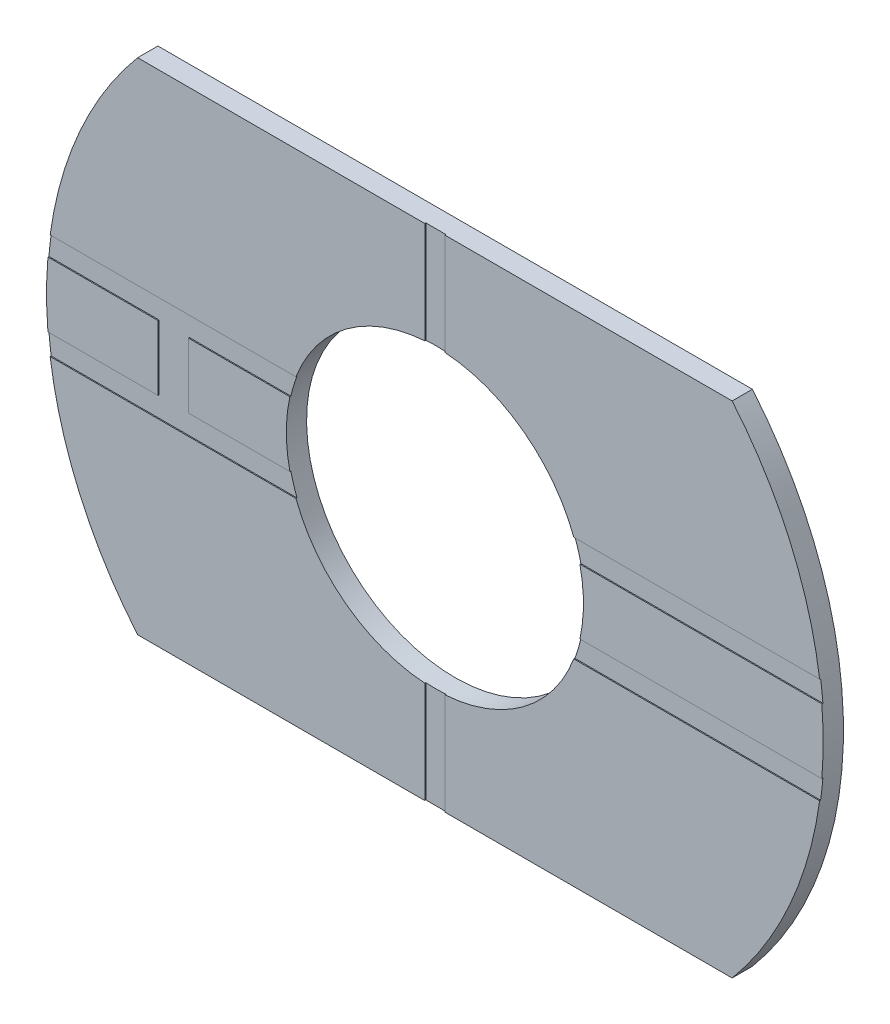
ISO-10303-21;
HEADER;
FILE_DESCRIPTION(('STEP AP214'),'2;1');
FILE_NAME('part.step','',(''),(''),'','','');
FILE_SCHEMA(('AUTOMOTIVE_DESIGN { 1 0 10303 214 1 1 1 1 }'));
ENDSEC;
DATA;
#1=APPLICATION_CONTEXT('core data for automotive mechanical design processes');
#2=APPLICATION_PROTOCOL_DEFINITION('international standard','automotive_design',2000,#1);
#3=PRODUCT_CONTEXT('',#1,'mechanical');
#4=PRODUCT('Part','Part','',(#3));
#5=PRODUCT_RELATED_PRODUCT_CATEGORY('part','',(#4));
#6=PRODUCT_DEFINITION_FORMATION('','',#4);
#7=PRODUCT_DEFINITION_CONTEXT('part definition',#1,'design');
#8=PRODUCT_DEFINITION('design','',#6,#7);
#9=PRODUCT_DEFINITION_SHAPE('','',#8);
#10=(LENGTH_UNIT() NAMED_UNIT(*) SI_UNIT(.MILLI.,.METRE.));
#11=(NAMED_UNIT(*) PLANE_ANGLE_UNIT() SI_UNIT($,.RADIAN.));
#12=(NAMED_UNIT(*) SI_UNIT($,.STERADIAN.) SOLID_ANGLE_UNIT());
#13=UNCERTAINTY_MEASURE_WITH_UNIT(LENGTH_MEASURE(1.E-05),#10,'distance_accuracy_value','');
#14=(GEOMETRIC_REPRESENTATION_CONTEXT(3) GLOBAL_UNCERTAINTY_ASSIGNED_CONTEXT((#13)) GLOBAL_UNIT_ASSIGNED_CONTEXT((#10,
#11,#12)) REPRESENTATION_CONTEXT('',''));
#15=CARTESIAN_POINT('',(0.,0.,0.));
#16=DIRECTION('',(0.,0.,1.));
#17=DIRECTION('',(1.,0.,0.));
#18=AXIS2_PLACEMENT_3D('',#15,#16,#17);
#19=CARTESIAN_POINT('',(0.,0.,3.));
#20=DIRECTION('',(0.,0.,1.));
#21=DIRECTION('',(1.,0.,0.));
#22=AXIS2_PLACEMENT_3D('',#19,#20,#21);
#23=PLANE('',#22);
#24=DIRECTION('',(0.,-1.,0.));
#25=VECTOR('',#24,1.);
#26=CARTESIAN_POINT('',(-1.5,37.,3.));
#27=LINE('',#26,#25);
#28=CARTESIAN_POINT('',(-1.5,37.,3.));
#29=VERTEX_POINT('',#28);
#30=CARTESIAN_POINT('',(-1.5,21.948804067648,3.));
#31=VERTEX_POINT('',#30);
#32=EDGE_CURVE('E274',#29,#31,#27,.T.);
#33=ORIENTED_EDGE('',*,*,#32,.F.);
#34=DIRECTION('',(1.,0.,0.));
#35=VECTOR('',#34,1.);
#36=CARTESIAN_POINT('',(-71.677108639134,37.,3.));
#37=LINE('',#36,#35);
#38=CARTESIAN_POINT('',(-44.0142022533636,37.,3.));
#39=VERTEX_POINT('',#38);
#40=EDGE_CURVE('E405',#39,#29,#37,.T.);
#41=ORIENTED_EDGE('',*,*,#40,.F.);
#42=CARTESIAN_POINT('',(0.,0.,3.));
#43=DIRECTION('',(0.,0.,1.));
#44=DIRECTION('',(1.,0.,0.));
#45=AXIS2_PLACEMENT_3D('',#42,#43,#44);
#46=CIRCLE('',#45,57.5);
#47=CARTESIAN_POINT('',(-56.96850006802,7.8,3.));
#48=VERTEX_POINT('',#47);
#49=EDGE_CURVE('E427',#39,#48,#46,.T.);
#50=ORIENTED_EDGE('',*,*,#49,.T.);
#51=DIRECTION('',(-1.,0.,0.));
#52=VECTOR('',#51,1.);
#53=CARTESIAN_POINT('',(-72.3710337647075,7.8,3.));
#54=LINE('',#53,#52);
#55=CARTESIAN_POINT('',(-20.5708531665558,7.8,3.));
#56=VERTEX_POINT('',#55);
#57=EDGE_CURVE('E319',#56,#48,#54,.T.);
#58=ORIENTED_EDGE('',*,*,#57,.F.);
#59=CARTESIAN_POINT('',(0.,0.,3.));
#60=DIRECTION('',(0.,0.,1.));
#61=DIRECTION('',(1.,0.,0.));
#62=AXIS2_PLACEMENT_3D('',#59,#60,#61);
#63=CIRCLE('',#62,22.);
#64=EDGE_CURVE('E535',#31,#56,#63,.T.);
#65=ORIENTED_EDGE('',*,*,#64,.F.);
#66=EDGE_LOOP('',(#33,#41,#50,#58,#65));
#67=FACE_BOUND('',#66,.T.);
#68=ADVANCED_FACE('F34',(#67),#23,.T.);
#69=DIRECTION('',(0.,1.,0.));
#70=VECTOR('',#69,1.);
#71=CARTESIAN_POINT('',(1.5,37.,3.));
#72=LINE('',#71,#70);
#73=CARTESIAN_POINT('',(1.5,21.948804067648,3.));
#74=VERTEX_POINT('',#73);
#75=CARTESIAN_POINT('',(1.5,37.,3.));
#76=VERTEX_POINT('',#75);
#77=EDGE_CURVE('E280',#74,#76,#72,.T.);
#78=ORIENTED_EDGE('',*,*,#77,.F.);
#79=CARTESIAN_POINT('',(20.5708531665558,7.8,3.));
#80=VERTEX_POINT('',#79);
#81=EDGE_CURVE('E419',#80,#74,#63,.T.);
#82=ORIENTED_EDGE('',*,*,#81,.F.);
#83=DIRECTION('',(-1.,0.,0.));
#84=VECTOR('',#83,1.);
#85=CARTESIAN_POINT('',(1.5,7.8,3.));
#86=LINE('',#85,#84);
#87=CARTESIAN_POINT('',(56.96850006802,7.8,3.));
#88=VERTEX_POINT('',#87);
#89=EDGE_CURVE('E340',#88,#80,#86,.T.);
#90=ORIENTED_EDGE('',*,*,#89,.F.);
#91=CARTESIAN_POINT('',(44.0142022533636,37.,3.));
#92=VERTEX_POINT('',#91);
#93=EDGE_CURVE('E479',#88,#92,#46,.T.);
#94=ORIENTED_EDGE('',*,*,#93,.T.);
#95=EDGE_CURVE('E408',#76,#92,#37,.T.);
#96=ORIENTED_EDGE('',*,*,#95,.F.);
#97=EDGE_LOOP('',(#78,#82,#90,#94,#96));
#98=FACE_BOUND('',#97,.T.);
#99=ADVANCED_FACE('F561',(#98),#23,.T.);
#100=DIRECTION('',(1.,0.,0.));
#101=VECTOR('',#100,1.);
#102=CARTESIAN_POINT('',(1.5,4.8,3.));
#103=LINE('',#102,#101);
#104=CARTESIAN_POINT('',(21.4699790405114,4.8,3.));
#105=VERTEX_POINT('',#104);
#106=CARTESIAN_POINT('',(57.2993019154684,4.8,3.));
#107=VERTEX_POINT('',#106);
#108=EDGE_CURVE('E338',#105,#107,#103,.T.);
#109=ORIENTED_EDGE('',*,*,#108,.F.);
#110=CARTESIAN_POINT('',(21.4699790405114,-4.8,3.));
#111=VERTEX_POINT('',#110);
#112=EDGE_CURVE('E415',#111,#105,#63,.T.);
#113=ORIENTED_EDGE('',*,*,#112,.F.);
#114=DIRECTION('',(-1.,0.,0.));
#115=VECTOR('',#114,1.);
#116=CARTESIAN_POINT('',(65.582153435322,-4.79999999999999,3.));
#117=LINE('',#116,#115);
#118=CARTESIAN_POINT('',(57.2993019154684,-4.79999999999999,3.));
#119=VERTEX_POINT('',#118);
#120=EDGE_CURVE('E336',#119,#111,#117,.T.);
#121=ORIENTED_EDGE('',*,*,#120,.F.);
#122=EDGE_CURVE('E426',#119,#107,#46,.T.);
#123=ORIENTED_EDGE('',*,*,#122,.T.);
#124=EDGE_LOOP('',(#109,#113,#121,#123));
#125=FACE_BOUND('',#124,.T.);
#126=ADVANCED_FACE('F465',(#125),#23,.T.);
#127=DIRECTION('',(1.,0.,0.));
#128=VECTOR('',#127,1.);
#129=CARTESIAN_POINT('',(65.582153435322,-7.79999999999999,3.));
#130=LINE('',#129,#128);
#131=CARTESIAN_POINT('',(20.5708531665558,-7.8,3.));
#132=VERTEX_POINT('',#131);
#133=CARTESIAN_POINT('',(56.96850006802,-7.79999999999999,3.));
#134=VERTEX_POINT('',#133);
#135=EDGE_CURVE('E334',#132,#134,#130,.T.);
#136=ORIENTED_EDGE('',*,*,#135,.F.);
#137=CARTESIAN_POINT('',(1.5,-21.948804067648,3.));
#138=VERTEX_POINT('',#137);
#139=EDGE_CURVE('E418',#138,#132,#63,.T.);
#140=ORIENTED_EDGE('',*,*,#139,.F.);
#141=DIRECTION('',(0.,1.,0.));
#142=VECTOR('',#141,1.);
#143=CARTESIAN_POINT('',(1.5,-7.8,3.));
#144=LINE('',#143,#142);
#145=CARTESIAN_POINT('',(1.50000000000001,-37.,3.));
#146=VERTEX_POINT('',#145);
#147=EDGE_CURVE('E332',#146,#138,#144,.T.);
#148=ORIENTED_EDGE('',*,*,#147,.F.);
#149=DIRECTION('',(-1.,0.,0.));
#150=VECTOR('',#149,1.);
#151=CARTESIAN_POINT('',(-71.677108639134,-37.,3.));
#152=LINE('',#151,#150);
#153=CARTESIAN_POINT('',(44.0142022533636,-37.,3.));
#154=VERTEX_POINT('',#153);
#155=EDGE_CURVE('E412',#154,#146,#152,.T.);
#156=ORIENTED_EDGE('',*,*,#155,.F.);
#157=EDGE_CURVE('E422',#154,#134,#46,.T.);
#158=ORIENTED_EDGE('',*,*,#157,.T.);
#159=EDGE_LOOP('',(#136,#140,#148,#156,#158));
#160=FACE_BOUND('',#159,.T.);
#161=ADVANCED_FACE('F514',(#160),#23,.T.);
#162=DIRECTION('',(0.,-1.,0.));
#163=VECTOR('',#162,1.);
#164=CARTESIAN_POINT('',(-1.5,-7.8,3.));
#165=LINE('',#164,#163);
#166=CARTESIAN_POINT('',(-1.5,-21.948804067648,3.));
#167=VERTEX_POINT('',#166);
#168=CARTESIAN_POINT('',(-1.5,-37.,3.));
#169=VERTEX_POINT('',#168);
#170=EDGE_CURVE('E330',#167,#169,#165,.T.);
#171=ORIENTED_EDGE('',*,*,#170,.F.);
#172=CARTESIAN_POINT('',(-20.5708531665558,-7.8,3.));
#173=VERTEX_POINT('',#172);
#174=EDGE_CURVE('E531',#173,#167,#63,.T.);
#175=ORIENTED_EDGE('',*,*,#174,.F.);
#176=DIRECTION('',(1.,0.,0.));
#177=VECTOR('',#176,1.);
#178=CARTESIAN_POINT('',(-1.5,-7.8,3.));
#179=LINE('',#178,#177);
#180=CARTESIAN_POINT('',(-56.96850006802,-7.8,3.));
#181=VERTEX_POINT('',#180);
#182=EDGE_CURVE('E328',#181,#173,#179,.T.);
#183=ORIENTED_EDGE('',*,*,#182,.F.);
#184=CARTESIAN_POINT('',(-44.0142022533636,-37.,3.));
#185=VERTEX_POINT('',#184);
#186=EDGE_CURVE('E425',#181,#185,#46,.T.);
#187=ORIENTED_EDGE('',*,*,#186,.T.);
#188=EDGE_CURVE('E400',#169,#185,#152,.T.);
#189=ORIENTED_EDGE('',*,*,#188,.F.);
#190=EDGE_LOOP('',(#171,#175,#183,#187,#189));
#191=FACE_BOUND('',#190,.T.);
#192=ADVANCED_FACE('F497',(#191),#23,.T.);
#193=DIRECTION('',(0.,-1.,0.));
#194=VECTOR('',#193,1.);
#195=CARTESIAN_POINT('',(-36.5,4.8,3.));
#196=LINE('',#195,#194);
#197=CARTESIAN_POINT('',(-36.5,4.8,3.));
#198=VERTEX_POINT('',#197);
#199=CARTESIAN_POINT('',(-36.5,-4.8,3.));
#200=VERTEX_POINT('',#199);
#201=EDGE_CURVE('E258',#198,#200,#196,.T.);
#202=ORIENTED_EDGE('',*,*,#201,.T.);
#203=DIRECTION('',(1.,0.,0.));
#204=VECTOR('',#203,1.);
#205=CARTESIAN_POINT('',(-1.5,-4.8,3.));
#206=LINE('',#205,#204);
#207=CARTESIAN_POINT('',(-21.4699790405114,-4.8,3.));
#208=VERTEX_POINT('',#207);
#209=EDGE_CURVE('E268',#200,#208,#206,.T.);
#210=ORIENTED_EDGE('',*,*,#209,.T.);
#211=CARTESIAN_POINT('',(-21.4699790405114,4.8,3.));
#212=VERTEX_POINT('',#211);
#213=EDGE_CURVE('E533',#212,#208,#63,.T.);
#214=ORIENTED_EDGE('',*,*,#213,.F.);
#215=DIRECTION('',(-1.,0.,0.));
#216=VECTOR('',#215,1.);
#217=CARTESIAN_POINT('',(-36.5,4.8,3.));
#218=LINE('',#217,#216);
#219=EDGE_CURVE('E271',#212,#198,#218,.T.);
#220=ORIENTED_EDGE('',*,*,#219,.T.);
#221=EDGE_LOOP('',(#202,#210,#214,#220));
#222=FACE_BOUND('',#221,.T.);
#223=ADVANCED_FACE('F572',(#222),#23,.T.);
#224=CARTESIAN_POINT('',(0.,0.,3.));
#225=DIRECTION('',(0.,0.,-1.));
#226=DIRECTION('',(-1.,0.,0.));
#227=AXIS2_PLACEMENT_3D('',#224,#225,#226);
#228=CYLINDRICAL_SURFACE('',#227,57.5);
#229=CARTESIAN_POINT('',(-57.2993019154684,4.8,3.));
#230=VERTEX_POINT('',#229);
#231=CARTESIAN_POINT('',(-57.2993019154684,-4.80000000000001,3.));
#232=VERTEX_POINT('',#231);
#233=EDGE_CURVE('E480',#230,#232,#46,.T.);
#234=ORIENTED_EDGE('',*,*,#233,.F.);
#235=DIRECTION('',(0.,0.,-1.));
#236=VECTOR('',#235,1.);
#237=CARTESIAN_POINT('',(-57.2993019154684,4.8,3.));
#238=LINE('',#237,#236);
#239=CARTESIAN_POINT('',(-57.2993019154684,4.8,2.85));
#240=VERTEX_POINT('',#239);
#241=EDGE_CURVE('E394',#230,#240,#238,.T.);
#242=ORIENTED_EDGE('',*,*,#241,.T.);
#243=CARTESIAN_POINT('',(0.,0.,2.85));
#244=DIRECTION('',(0.,0.,1.));
#245=DIRECTION('',(1.,0.,0.));
#246=AXIS2_PLACEMENT_3D('',#243,#244,#245);
#247=CIRCLE('',#246,57.5);
#248=CARTESIAN_POINT('',(-56.96850006802,7.8,2.85));
#249=VERTEX_POINT('',#248);
#250=EDGE_CURVE('E367',#249,#240,#247,.T.);
#251=ORIENTED_EDGE('',*,*,#250,.F.);
#252=DIRECTION('',(0.,0.,-1.));
#253=VECTOR('',#252,1.);
#254=CARTESIAN_POINT('',(-56.96850006802,7.8,3.));
#255=LINE('',#254,#253);
#256=EDGE_CURVE('E376',#249,#48,#255,.F.);
#257=ORIENTED_EDGE('',*,*,#256,.T.);
#258=ORIENTED_EDGE('',*,*,#49,.F.);
#259=DIRECTION('',(0.,0.,-1.));
#260=VECTOR('',#259,1.);
#261=CARTESIAN_POINT('',(-44.0142022533636,37.,3.));
#262=LINE('',#261,#260);
#263=CARTESIAN_POINT('',(-44.0142022533636,37.,0.));
#264=VERTEX_POINT('',#263);
#265=EDGE_CURVE('E441',#39,#264,#262,.T.);
#266=ORIENTED_EDGE('',*,*,#265,.T.);
#267=CARTESIAN_POINT('',(0.,0.,0.));
#268=DIRECTION('',(0.,0.,1.));
#269=DIRECTION('',(1.,0.,0.));
#270=AXIS2_PLACEMENT_3D('',#267,#268,#269);
#271=CIRCLE('',#270,57.5);
#272=CARTESIAN_POINT('',(-44.0142022533636,-37.,0.));
#273=VERTEX_POINT('',#272);
#274=EDGE_CURVE('E431',#264,#273,#271,.T.);
#275=ORIENTED_EDGE('',*,*,#274,.T.);
#276=DIRECTION('',(0.,0.,-1.));
#277=VECTOR('',#276,1.);
#278=CARTESIAN_POINT('',(-44.0142022533636,-37.,3.));
#279=LINE('',#278,#277);
#280=EDGE_CURVE('E432',#273,#185,#279,.F.);
#281=ORIENTED_EDGE('',*,*,#280,.T.);
#282=ORIENTED_EDGE('',*,*,#186,.F.);
#283=DIRECTION('',(0.,0.,-1.));
#284=VECTOR('',#283,1.);
#285=CARTESIAN_POINT('',(-56.96850006802,-7.8,3.));
#286=LINE('',#285,#284);
#287=CARTESIAN_POINT('',(-56.96850006802,-7.8,2.85));
#288=VERTEX_POINT('',#287);
#289=EDGE_CURVE('E379',#181,#288,#286,.T.);
#290=ORIENTED_EDGE('',*,*,#289,.T.);
#291=CARTESIAN_POINT('',(-57.2993019154684,-4.80000000000001,2.85));
#292=VERTEX_POINT('',#291);
#293=EDGE_CURVE('E365',#292,#288,#247,.T.);
#294=ORIENTED_EDGE('',*,*,#293,.F.);
#295=DIRECTION('',(0.,0.,-1.));
#296=VECTOR('',#295,1.);
#297=CARTESIAN_POINT('',(-57.2993019154684,-4.80000000000001,3.));
#298=LINE('',#297,#296);
#299=EDGE_CURVE('E397',#292,#232,#298,.F.);
#300=ORIENTED_EDGE('',*,*,#299,.T.);
#301=EDGE_LOOP('',(#234,#242,#251,#257,#258,#266,#275,#281,#282,#290,#294,#300));
#302=FACE_BOUND('',#301,.T.);
#303=ADVANCED_FACE('F504',(#302),#228,.T.);
#304=DIRECTION('',(-1.,0.,0.));
#305=VECTOR('',#304,1.);
#306=CARTESIAN_POINT('',(-41.,-4.80000000000001,3.));
#307=LINE('',#306,#305);
#308=CARTESIAN_POINT('',(-41.,-4.80000000000001,3.));
#309=VERTEX_POINT('',#308);
#310=EDGE_CURVE('E326',#309,#232,#307,.T.);
#311=ORIENTED_EDGE('',*,*,#310,.F.);
#312=DIRECTION('',(0.,-1.,0.));
#313=VECTOR('',#312,1.);
#314=CARTESIAN_POINT('',(-41.,4.8,3.));
#315=LINE('',#314,#313);
#316=CARTESIAN_POINT('',(-41.,4.8,3.));
#317=VERTEX_POINT('',#316);
#318=EDGE_CURVE('E323',#317,#309,#315,.T.);
#319=ORIENTED_EDGE('',*,*,#318,.F.);
#320=DIRECTION('',(1.,0.,0.));
#321=VECTOR('',#320,1.);
#322=CARTESIAN_POINT('',(-72.3710337647075,4.8,3.));
#323=LINE('',#322,#321);
#324=EDGE_CURVE('E321',#230,#317,#323,.T.);
#325=ORIENTED_EDGE('',*,*,#324,.F.);
#326=ORIENTED_EDGE('',*,*,#233,.T.);
#327=EDGE_LOOP('',(#311,#319,#325,#326));
#328=FACE_BOUND('',#327,.T.);
#329=ADVANCED_FACE('F563',(#328),#23,.T.);
#330=CARTESIAN_POINT('',(0.,0.,0.));
#331=DIRECTION('',(0.,0.,1.));
#332=DIRECTION('',(1.,0.,0.));
#333=AXIS2_PLACEMENT_3D('',#330,#331,#332);
#334=PLANE('',#333);
#335=ORIENTED_EDGE('',*,*,#274,.F.);
#336=DIRECTION('',(1.,0.,0.));
#337=VECTOR('',#336,1.);
#338=CARTESIAN_POINT('',(-71.677108639134,37.,0.));
#339=LINE('',#338,#337);
#340=CARTESIAN_POINT('',(44.0142022533636,37.,0.));
#341=VERTEX_POINT('',#340);
#342=EDGE_CURVE('E401',#264,#341,#339,.T.);
#343=ORIENTED_EDGE('',*,*,#342,.T.);
#344=CARTESIAN_POINT('',(44.0142022533636,-37.,0.));
#345=VERTEX_POINT('',#344);
#346=EDGE_CURVE('E428',#345,#341,#271,.T.);
#347=ORIENTED_EDGE('',*,*,#346,.F.);
#348=DIRECTION('',(-1.,0.,0.));
#349=VECTOR('',#348,1.);
#350=CARTESIAN_POINT('',(-71.677108639134,-37.,0.));
#351=LINE('',#350,#349);
#352=EDGE_CURVE('E409',#345,#273,#351,.T.);
#353=ORIENTED_EDGE('',*,*,#352,.T.);
#354=EDGE_LOOP('',(#335,#343,#347,#353));
#355=FACE_BOUND('',#354,.T.);
#356=CARTESIAN_POINT('',(0.,0.,0.));
#357=DIRECTION('',(0.,0.,1.));
#358=DIRECTION('',(1.,0.,0.));
#359=AXIS2_PLACEMENT_3D('',#356,#357,#358);
#360=CIRCLE('',#359,22.);
#361=CARTESIAN_POINT('',(22.,0.,0.));
#362=VERTEX_POINT('',#361);
#363=EDGE_CURVE('E404',#362,#362,#360,.T.);
#364=ORIENTED_EDGE('',*,*,#363,.T.);
#365=EDGE_LOOP('',(#364));
#366=FACE_BOUND('',#365,.T.);
#367=ADVANCED_FACE('F507',(#355,#366),#334,.F.);
#368=ORIENTED_EDGE('',*,*,#93,.F.);
#369=DIRECTION('',(0.,0.,-1.));
#370=VECTOR('',#369,1.);
#371=CARTESIAN_POINT('',(56.96850006802,7.8,3.));
#372=LINE('',#371,#370);
#373=CARTESIAN_POINT('',(56.96850006802,7.8,2.85));
#374=VERTEX_POINT('',#373);
#375=EDGE_CURVE('E391',#88,#374,#372,.T.);
#376=ORIENTED_EDGE('',*,*,#375,.T.);
#377=CARTESIAN_POINT('',(0.,0.,2.85));
#378=DIRECTION('',(0.,0.,1.));
#379=DIRECTION('',(1.,0.,0.));
#380=AXIS2_PLACEMENT_3D('',#377,#378,#379);
#381=CIRCLE('',#380,57.5);
#382=CARTESIAN_POINT('',(57.2993019154684,4.8,2.85));
#383=VERTEX_POINT('',#382);
#384=EDGE_CURVE('E364',#383,#374,#381,.T.);
#385=ORIENTED_EDGE('',*,*,#384,.F.);
#386=DIRECTION('',(0.,0.,-1.));
#387=VECTOR('',#386,1.);
#388=CARTESIAN_POINT('',(57.2993019154684,4.8,3.));
#389=LINE('',#388,#387);
#390=EDGE_CURVE('E388',#383,#107,#389,.F.);
#391=ORIENTED_EDGE('',*,*,#390,.T.);
#392=ORIENTED_EDGE('',*,*,#122,.F.);
#393=DIRECTION('',(0.,0.,-1.));
#394=VECTOR('',#393,1.);
#395=CARTESIAN_POINT('',(57.2993019154684,-4.79999999999999,3.));
#396=LINE('',#395,#394);
#397=CARTESIAN_POINT('',(57.2993019154684,-4.79999999999999,2.85));
#398=VERTEX_POINT('',#397);
#399=EDGE_CURVE('E385',#119,#398,#396,.T.);
#400=ORIENTED_EDGE('',*,*,#399,.T.);
#401=CARTESIAN_POINT('',(56.96850006802,-7.79999999999999,2.85));
#402=VERTEX_POINT('',#401);
#403=EDGE_CURVE('E362',#402,#398,#381,.T.);
#404=ORIENTED_EDGE('',*,*,#403,.F.);
#405=DIRECTION('',(0.,0.,-1.));
#406=VECTOR('',#405,1.);
#407=CARTESIAN_POINT('',(56.96850006802,-7.79999999999999,3.));
#408=LINE('',#407,#406);
#409=EDGE_CURVE('E382',#402,#134,#408,.F.);
#410=ORIENTED_EDGE('',*,*,#409,.T.);
#411=ORIENTED_EDGE('',*,*,#157,.F.);
#412=DIRECTION('',(0.,0.,-1.));
#413=VECTOR('',#412,1.);
#414=CARTESIAN_POINT('',(44.0142022533636,-37.,3.));
#415=LINE('',#414,#413);
#416=EDGE_CURVE('E435',#154,#345,#415,.T.);
#417=ORIENTED_EDGE('',*,*,#416,.T.);
#418=ORIENTED_EDGE('',*,*,#346,.T.);
#419=DIRECTION('',(0.,0.,-1.));
#420=VECTOR('',#419,1.);
#421=CARTESIAN_POINT('',(44.0142022533636,37.,3.));
#422=LINE('',#421,#420);
#423=EDGE_CURVE('E438',#341,#92,#422,.F.);
#424=ORIENTED_EDGE('',*,*,#423,.T.);
#425=EDGE_LOOP('',(#368,#376,#385,#391,#392,#400,#404,#410,#411,#417,#418,#424));
#426=FACE_BOUND('',#425,.T.);
#427=ADVANCED_FACE('F36',(#426),#228,.T.);
#428=CARTESIAN_POINT('',(0.,0.,3.));
#429=DIRECTION('',(0.,0.,-1.));
#430=DIRECTION('',(-1.,0.,0.));
#431=AXIS2_PLACEMENT_3D('',#428,#429,#430);
#432=CYLINDRICAL_SURFACE('',#431,22.);
#433=DIRECTION('',(0.,0.,-1.));
#434=VECTOR('',#433,1.);
#435=CARTESIAN_POINT('',(20.5708531665558,7.8,3.));
#436=LINE('',#435,#434);
#437=CARTESIAN_POINT('',(20.5708531665558,7.8,2.85));
#438=VERTEX_POINT('',#437);
#439=EDGE_CURVE('E11',#80,#438,#436,.T.);
#440=ORIENTED_EDGE('',*,*,#439,.F.);
#441=ORIENTED_EDGE('',*,*,#81,.T.);
#442=DIRECTION('',(0.,0.,-1.));
#443=VECTOR('',#442,1.);
#444=CARTESIAN_POINT('',(1.5,21.948804067648,3.));
#445=LINE('',#444,#443);
#446=CARTESIAN_POINT('',(1.5,21.948804067648,2.85));
#447=VERTEX_POINT('',#446);
#448=EDGE_CURVE('E368',#447,#74,#445,.F.);
#449=ORIENTED_EDGE('',*,*,#448,.F.);
#450=CARTESIAN_POINT('',(0.,0.,2.85));
#451=DIRECTION('',(0.,0.,1.));
#452=DIRECTION('',(1.,0.,0.));
#453=AXIS2_PLACEMENT_3D('',#450,#451,#452);
#454=CIRCLE('',#453,22.);
#455=CARTESIAN_POINT('',(-1.5,21.948804067648,2.85));
#456=VERTEX_POINT('',#455);
#457=EDGE_CURVE('E588',#447,#456,#454,.T.);
#458=ORIENTED_EDGE('',*,*,#457,.T.);
#459=DIRECTION('',(0.,0.,-1.));
#460=VECTOR('',#459,1.);
#461=CARTESIAN_POINT('',(-1.5,21.948804067648,3.));
#462=LINE('',#461,#460);
#463=EDGE_CURVE('E370',#31,#456,#462,.T.);
#464=ORIENTED_EDGE('',*,*,#463,.F.);
#465=ORIENTED_EDGE('',*,*,#64,.T.);
#466=DIRECTION('',(0.,0.,-1.));
#467=VECTOR('',#466,1.);
#468=CARTESIAN_POINT('',(-20.5708531665558,7.8,3.));
#469=LINE('',#468,#467);
#470=CARTESIAN_POINT('',(-20.5708531665558,7.8,2.85));
#471=VERTEX_POINT('',#470);
#472=EDGE_CURVE('E445',#471,#56,#469,.F.);
#473=ORIENTED_EDGE('',*,*,#472,.F.);
#474=CARTESIAN_POINT('',(-21.4699790405114,4.8,2.85));
#475=VERTEX_POINT('',#474);
#476=EDGE_CURVE('E585',#471,#475,#454,.T.);
#477=ORIENTED_EDGE('',*,*,#476,.T.);
#478=DIRECTION('',(0.,0.,-1.));
#479=VECTOR('',#478,1.);
#480=CARTESIAN_POINT('',(-21.4699790405114,4.8,3.));
#481=LINE('',#480,#479);
#482=EDGE_CURVE('E247',#475,#212,#481,.F.);
#483=ORIENTED_EDGE('',*,*,#482,.T.);
#484=ORIENTED_EDGE('',*,*,#213,.T.);
#485=DIRECTION('',(0.,0.,-1.));
#486=VECTOR('',#485,1.);
#487=CARTESIAN_POINT('',(-21.4699790405114,-4.8,3.));
#488=LINE('',#487,#486);
#489=CARTESIAN_POINT('',(-21.4699790405114,-4.8,2.85));
#490=VERTEX_POINT('',#489);
#491=EDGE_CURVE('E447',#208,#490,#488,.T.);
#492=ORIENTED_EDGE('',*,*,#491,.T.);
#493=CARTESIAN_POINT('',(-20.5708531665558,-7.8,2.85));
#494=VERTEX_POINT('',#493);
#495=EDGE_CURVE('E589',#490,#494,#454,.T.);
#496=ORIENTED_EDGE('',*,*,#495,.T.);
#497=DIRECTION('',(0.,0.,-1.));
#498=VECTOR('',#497,1.);
#499=CARTESIAN_POINT('',(-20.5708531665558,-7.8,3.));
#500=LINE('',#499,#498);
#501=EDGE_CURVE('E450',#173,#494,#500,.T.);
#502=ORIENTED_EDGE('',*,*,#501,.F.);
#503=ORIENTED_EDGE('',*,*,#174,.T.);
#504=DIRECTION('',(0.,0.,-1.));
#505=VECTOR('',#504,1.);
#506=CARTESIAN_POINT('',(-1.5,-21.948804067648,3.));
#507=LINE('',#506,#505);
#508=CARTESIAN_POINT('',(-1.5,-21.948804067648,2.85));
#509=VERTEX_POINT('',#508);
#510=EDGE_CURVE('E372',#509,#167,#507,.F.);
#511=ORIENTED_EDGE('',*,*,#510,.F.);
#512=CARTESIAN_POINT('',(1.5,-21.948804067648,2.85));
#513=VERTEX_POINT('',#512);
#514=EDGE_CURVE('E360',#509,#513,#454,.T.);
#515=ORIENTED_EDGE('',*,*,#514,.T.);
#516=DIRECTION('',(0.,0.,-1.));
#517=VECTOR('',#516,1.);
#518=CARTESIAN_POINT('',(1.5,-21.948804067648,3.));
#519=LINE('',#518,#517);
#520=EDGE_CURVE('E374',#138,#513,#519,.T.);
#521=ORIENTED_EDGE('',*,*,#520,.F.);
#522=ORIENTED_EDGE('',*,*,#139,.T.);
#523=DIRECTION('',(0.,0.,-1.));
#524=VECTOR('',#523,1.);
#525=CARTESIAN_POINT('',(20.5708531665558,-7.8,3.));
#526=LINE('',#525,#524);
#527=CARTESIAN_POINT('',(20.5708531665558,-7.8,2.85));
#528=VERTEX_POINT('',#527);
#529=EDGE_CURVE('E452',#528,#132,#526,.F.);
#530=ORIENTED_EDGE('',*,*,#529,.F.);
#531=CARTESIAN_POINT('',(21.4699790405114,-4.8,2.85));
#532=VERTEX_POINT('',#531);
#533=EDGE_CURVE('E345',#528,#532,#454,.T.);
#534=ORIENTED_EDGE('',*,*,#533,.T.);
#535=DIRECTION('',(0.,0.,-1.));
#536=VECTOR('',#535,1.);
#537=CARTESIAN_POINT('',(21.4699790405114,-4.8,3.));
#538=LINE('',#537,#536);
#539=EDGE_CURVE('E454',#111,#532,#538,.T.);
#540=ORIENTED_EDGE('',*,*,#539,.F.);
#541=ORIENTED_EDGE('',*,*,#112,.T.);
#542=DIRECTION('',(0.,0.,-1.));
#543=VECTOR('',#542,1.);
#544=CARTESIAN_POINT('',(21.4699790405114,4.8,3.));
#545=LINE('',#544,#543);
#546=CARTESIAN_POINT('',(21.4699790405114,4.8,2.85));
#547=VERTEX_POINT('',#546);
#548=EDGE_CURVE('E42',#547,#105,#545,.F.);
#549=ORIENTED_EDGE('',*,*,#548,.F.);
#550=EDGE_CURVE('E361',#547,#438,#454,.T.);
#551=ORIENTED_EDGE('',*,*,#550,.T.);
#552=EDGE_LOOP('',(#440,#441,#449,#458,#464,#465,#473,#477,#483,#484,#492,#496,#502,#503,#511,
#515,#521,#522,#530,#534,#540,#541,#549,#551));
#553=FACE_BOUND('',#552,.T.);
#554=ORIENTED_EDGE('',*,*,#363,.F.);
#555=EDGE_LOOP('',(#554));
#556=FACE_BOUND('',#555,.T.);
#557=ADVANCED_FACE('F470',(#553,#556),#432,.F.);
#558=CARTESIAN_POINT('',(-71.677108639134,-37.,0.));
#559=DIRECTION('',(0.,1.,0.));
#560=DIRECTION('',(0.,0.,1.));
#561=AXIS2_PLACEMENT_3D('',#558,#559,#560);
#562=PLANE('',#561);
#563=ORIENTED_EDGE('',*,*,#155,.T.);
#564=DIRECTION('',(0.,0.,1.));
#565=VECTOR('',#564,1.);
#566=CARTESIAN_POINT('',(1.50000000000001,-37.,2.85));
#567=LINE('',#566,#565);
#568=CARTESIAN_POINT('',(1.50000000000001,-37.,2.85));
#569=VERTEX_POINT('',#568);
#570=EDGE_CURVE('E349',#569,#146,#567,.T.);
#571=ORIENTED_EDGE('',*,*,#570,.F.);
#572=DIRECTION('',(1.,0.,0.));
#573=VECTOR('',#572,1.);
#574=CARTESIAN_POINT('',(-1.5,-37.,2.85));
#575=LINE('',#574,#573);
#576=CARTESIAN_POINT('',(-1.5,-37.,2.85));
#577=VERTEX_POINT('',#576);
#578=EDGE_CURVE('E297',#577,#569,#575,.T.);
#579=ORIENTED_EDGE('',*,*,#578,.F.);
#580=DIRECTION('',(0.,0.,1.));
#581=VECTOR('',#580,1.);
#582=CARTESIAN_POINT('',(-1.5,-37.,2.85));
#583=LINE('',#582,#581);
#584=EDGE_CURVE('E351',#577,#169,#583,.T.);
#585=ORIENTED_EDGE('',*,*,#584,.T.);
#586=ORIENTED_EDGE('',*,*,#188,.T.);
#587=ORIENTED_EDGE('',*,*,#280,.F.);
#588=ORIENTED_EDGE('',*,*,#352,.F.);
#589=ORIENTED_EDGE('',*,*,#416,.F.);
#590=EDGE_LOOP('',(#563,#571,#579,#585,#586,#587,#588,#589));
#591=FACE_BOUND('',#590,.T.);
#592=ADVANCED_FACE('F501',(#591),#562,.F.);
#593=CARTESIAN_POINT('',(-71.677108639134,37.,0.));
#594=DIRECTION('',(0.,-1.,0.));
#595=DIRECTION('',(0.,0.,-1.));
#596=AXIS2_PLACEMENT_3D('',#593,#594,#595);
#597=PLANE('',#596);
#598=ORIENTED_EDGE('',*,*,#40,.T.);
#599=DIRECTION('',(0.,0.,1.));
#600=VECTOR('',#599,1.);
#601=CARTESIAN_POINT('',(-1.5,37.,2.85));
#602=LINE('',#601,#600);
#603=CARTESIAN_POINT('',(-1.5,37.,2.85));
#604=VERTEX_POINT('',#603);
#605=EDGE_CURVE('E343',#604,#29,#602,.T.);
#606=ORIENTED_EDGE('',*,*,#605,.F.);
#607=DIRECTION('',(-1.,0.,0.));
#608=VECTOR('',#607,1.);
#609=CARTESIAN_POINT('',(-1.5,37.,2.85));
#610=LINE('',#609,#608);
#611=CARTESIAN_POINT('',(1.5,37.,2.85));
#612=VERTEX_POINT('',#611);
#613=EDGE_CURVE('E314',#612,#604,#610,.T.);
#614=ORIENTED_EDGE('',*,*,#613,.F.);
#615=DIRECTION('',(0.,0.,1.));
#616=VECTOR('',#615,1.);
#617=CARTESIAN_POINT('',(1.5,37.,2.85));
#618=LINE('',#617,#616);
#619=EDGE_CURVE('E346',#612,#76,#618,.T.);
#620=ORIENTED_EDGE('',*,*,#619,.T.);
#621=ORIENTED_EDGE('',*,*,#95,.T.);
#622=ORIENTED_EDGE('',*,*,#423,.F.);
#623=ORIENTED_EDGE('',*,*,#342,.F.);
#624=ORIENTED_EDGE('',*,*,#265,.F.);
#625=EDGE_LOOP('',(#598,#606,#614,#620,#621,#622,#623,#624));
#626=FACE_BOUND('',#625,.T.);
#627=ADVANCED_FACE('F557',(#626),#597,.F.);
#628=CARTESIAN_POINT('',(0.,0.,2.85));
#629=DIRECTION('',(0.,0.,1.));
#630=DIRECTION('',(1.,0.,0.));
#631=AXIS2_PLACEMENT_3D('',#628,#629,#630);
#632=PLANE('',#631);
#633=DIRECTION('',(0.,1.,0.));
#634=VECTOR('',#633,1.);
#635=CARTESIAN_POINT('',(1.5,37.,2.85));
#636=LINE('',#635,#634);
#637=EDGE_CURVE('E311',#447,#612,#636,.T.);
#638=ORIENTED_EDGE('',*,*,#637,.T.);
#639=ORIENTED_EDGE('',*,*,#613,.T.);
#640=DIRECTION('',(0.,-1.,0.));
#641=VECTOR('',#640,1.);
#642=CARTESIAN_POINT('',(-1.5,37.,2.85));
#643=LINE('',#642,#641);
#644=EDGE_CURVE('E276',#604,#456,#643,.T.);
#645=ORIENTED_EDGE('',*,*,#644,.T.);
#646=ORIENTED_EDGE('',*,*,#457,.F.);
#647=EDGE_LOOP('',(#638,#639,#645,#646));
#648=FACE_BOUND('',#647,.T.);
#649=ADVANCED_FACE('F543',(#648),#632,.T.);
#650=CARTESIAN_POINT('',(1.5,37.,2.85));
#651=DIRECTION('',(1.,0.,0.));
#652=DIRECTION('',(0.,1.,0.));
#653=AXIS2_PLACEMENT_3D('',#650,#651,#652);
#654=PLANE('',#653);
#655=ORIENTED_EDGE('',*,*,#448,.T.);
#656=ORIENTED_EDGE('',*,*,#77,.T.);
#657=ORIENTED_EDGE('',*,*,#619,.F.);
#658=ORIENTED_EDGE('',*,*,#637,.F.);
#659=EDGE_LOOP('',(#655,#656,#657,#658));
#660=FACE_BOUND('',#659,.T.);
#661=ADVANCED_FACE('F556',(#660),#654,.F.);
#662=CARTESIAN_POINT('',(-1.5,37.,2.85));
#663=DIRECTION('',(-1.,0.,0.));
#664=DIRECTION('',(0.,-1.,0.));
#665=AXIS2_PLACEMENT_3D('',#662,#663,#664);
#666=PLANE('',#665);
#667=ORIENTED_EDGE('',*,*,#463,.T.);
#668=ORIENTED_EDGE('',*,*,#644,.F.);
#669=ORIENTED_EDGE('',*,*,#605,.T.);
#670=ORIENTED_EDGE('',*,*,#32,.T.);
#671=EDGE_LOOP('',(#667,#668,#669,#670));
#672=FACE_BOUND('',#671,.T.);
#673=ADVANCED_FACE('F624',(#672),#666,.F.);
#674=DIRECTION('',(0.,-1.,0.));
#675=VECTOR('',#674,1.);
#676=CARTESIAN_POINT('',(-1.5,-7.8,2.85));
#677=LINE('',#676,#675);
#678=EDGE_CURVE('E294',#509,#577,#677,.T.);
#679=ORIENTED_EDGE('',*,*,#678,.T.);
#680=ORIENTED_EDGE('',*,*,#578,.T.);
#681=DIRECTION('',(0.,1.,0.));
#682=VECTOR('',#681,1.);
#683=CARTESIAN_POINT('',(1.5,-7.8,2.85));
#684=LINE('',#683,#682);
#685=EDGE_CURVE('E300',#569,#513,#684,.T.);
#686=ORIENTED_EDGE('',*,*,#685,.T.);
#687=ORIENTED_EDGE('',*,*,#514,.F.);
#688=EDGE_LOOP('',(#679,#680,#686,#687));
#689=FACE_BOUND('',#688,.T.);
#690=ADVANCED_FACE('F524',(#689),#632,.T.);
#691=CARTESIAN_POINT('',(-1.5,-7.8,2.85));
#692=DIRECTION('',(-1.,0.,0.));
#693=DIRECTION('',(0.,-1.,0.));
#694=AXIS2_PLACEMENT_3D('',#691,#692,#693);
#695=PLANE('',#694);
#696=ORIENTED_EDGE('',*,*,#510,.T.);
#697=ORIENTED_EDGE('',*,*,#170,.T.);
#698=ORIENTED_EDGE('',*,*,#584,.F.);
#699=ORIENTED_EDGE('',*,*,#678,.F.);
#700=EDGE_LOOP('',(#696,#697,#698,#699));
#701=FACE_BOUND('',#700,.T.);
#702=ADVANCED_FACE('F528',(#701),#695,.F.);
#703=CARTESIAN_POINT('',(1.5,-7.8,2.85));
#704=DIRECTION('',(1.,0.,0.));
#705=DIRECTION('',(0.,1.,0.));
#706=AXIS2_PLACEMENT_3D('',#703,#704,#705);
#707=PLANE('',#706);
#708=ORIENTED_EDGE('',*,*,#520,.T.);
#709=ORIENTED_EDGE('',*,*,#685,.F.);
#710=ORIENTED_EDGE('',*,*,#570,.T.);
#711=ORIENTED_EDGE('',*,*,#147,.T.);
#712=EDGE_LOOP('',(#708,#709,#710,#711));
#713=FACE_BOUND('',#712,.T.);
#714=ADVANCED_FACE('F520',(#713),#707,.F.);
#715=CARTESIAN_POINT('',(-1.5,-4.8,2.85));
#716=DIRECTION('',(0.,-1.,0.));
#717=DIRECTION('',(1.,0.,0.));
#718=AXIS2_PLACEMENT_3D('',#715,#716,#717);
#719=PLANE('',#718);
#720=ORIENTED_EDGE('',*,*,#209,.F.);
#721=DIRECTION('',(0.,0.,1.));
#722=VECTOR('',#721,1.);
#723=CARTESIAN_POINT('',(-36.5,-4.8,2.85));
#724=LINE('',#723,#722);
#725=CARTESIAN_POINT('',(-36.5,-4.8,2.85));
#726=VERTEX_POINT('',#725);
#727=EDGE_CURVE('E260',#726,#200,#724,.T.);
#728=ORIENTED_EDGE('',*,*,#727,.F.);
#729=DIRECTION('',(1.,0.,0.));
#730=VECTOR('',#729,1.);
#731=CARTESIAN_POINT('',(-1.5,-4.8,2.85));
#732=LINE('',#731,#730);
#733=EDGE_CURVE('E252',#726,#490,#732,.T.);
#734=ORIENTED_EDGE('',*,*,#733,.T.);
#735=ORIENTED_EDGE('',*,*,#491,.F.);
#736=EDGE_LOOP('',(#720,#728,#734,#735));
#737=FACE_BOUND('',#736,.T.);
#738=ADVANCED_FACE('F593',(#737),#719,.T.);
#739=CARTESIAN_POINT('',(-36.5,4.8,2.85));
#740=DIRECTION('',(0.,1.,0.));
#741=DIRECTION('',(0.,0.,1.));
#742=AXIS2_PLACEMENT_3D('',#739,#740,#741);
#743=PLANE('',#742);
#744=DIRECTION('',(-1.,0.,0.));
#745=VECTOR('',#744,1.);
#746=CARTESIAN_POINT('',(-36.5,4.8,2.85));
#747=LINE('',#746,#745);
#748=CARTESIAN_POINT('',(-36.5,4.8,2.85));
#749=VERTEX_POINT('',#748);
#750=EDGE_CURVE('E241',#475,#749,#747,.T.);
#751=ORIENTED_EDGE('',*,*,#750,.T.);
#752=DIRECTION('',(0.,0.,1.));
#753=VECTOR('',#752,1.);
#754=CARTESIAN_POINT('',(-36.5,4.8,2.85));
#755=LINE('',#754,#753);
#756=EDGE_CURVE('E244',#749,#198,#755,.T.);
#757=ORIENTED_EDGE('',*,*,#756,.T.);
#758=ORIENTED_EDGE('',*,*,#219,.F.);
#759=ORIENTED_EDGE('',*,*,#482,.F.);
#760=EDGE_LOOP('',(#751,#757,#758,#759));
#761=FACE_BOUND('',#760,.T.);
#762=ADVANCED_FACE('F243',(#761),#743,.T.);
#763=ORIENTED_EDGE('',*,*,#250,.T.);
#764=DIRECTION('',(1.,0.,0.));
#765=VECTOR('',#764,1.);
#766=CARTESIAN_POINT('',(-72.3710337647075,4.8,2.85));
#767=LINE('',#766,#765);
#768=CARTESIAN_POINT('',(-41.,4.8,2.85));
#769=VERTEX_POINT('',#768);
#770=EDGE_CURVE('E283',#240,#769,#767,.T.);
#771=ORIENTED_EDGE('',*,*,#770,.T.);
#772=DIRECTION('',(0.,-1.,0.));
#773=VECTOR('',#772,1.);
#774=CARTESIAN_POINT('',(-41.,4.8,2.85));
#775=LINE('',#774,#773);
#776=CARTESIAN_POINT('',(-41.,-4.80000000000001,2.85));
#777=VERTEX_POINT('',#776);
#778=EDGE_CURVE('E285',#769,#777,#775,.T.);
#779=ORIENTED_EDGE('',*,*,#778,.T.);
#780=DIRECTION('',(-1.,0.,0.));
#781=VECTOR('',#780,1.);
#782=CARTESIAN_POINT('',(-41.,-4.80000000000001,2.85));
#783=LINE('',#782,#781);
#784=EDGE_CURVE('E288',#777,#292,#783,.T.);
#785=ORIENTED_EDGE('',*,*,#784,.T.);
#786=ORIENTED_EDGE('',*,*,#293,.T.);
#787=DIRECTION('',(1.,0.,0.));
#788=VECTOR('',#787,1.);
#789=CARTESIAN_POINT('',(-1.5,-7.8,2.85));
#790=LINE('',#789,#788);
#791=EDGE_CURVE('E291',#288,#494,#790,.T.);
#792=ORIENTED_EDGE('',*,*,#791,.T.);
#793=ORIENTED_EDGE('',*,*,#495,.F.);
#794=ORIENTED_EDGE('',*,*,#733,.F.);
#795=DIRECTION('',(0.,-1.,0.));
#796=VECTOR('',#795,1.);
#797=CARTESIAN_POINT('',(-36.5,4.8,2.85));
#798=LINE('',#797,#796);
#799=EDGE_CURVE('E251',#749,#726,#798,.T.);
#800=ORIENTED_EDGE('',*,*,#799,.F.);
#801=ORIENTED_EDGE('',*,*,#750,.F.);
#802=ORIENTED_EDGE('',*,*,#476,.F.);
#803=DIRECTION('',(-1.,0.,0.));
#804=VECTOR('',#803,1.);
#805=CARTESIAN_POINT('',(-72.3710337647075,7.8,2.85));
#806=LINE('',#805,#804);
#807=EDGE_CURVE('E279',#471,#249,#806,.T.);
#808=ORIENTED_EDGE('',*,*,#807,.T.);
#809=EDGE_LOOP('',(#763,#771,#779,#785,#786,#792,#793,#794,#800,#801,#802,#808));
#810=FACE_BOUND('',#809,.T.);
#811=ADVANCED_FACE('F263',(#810),#632,.T.);
#812=CARTESIAN_POINT('',(-72.3710337647075,7.8,2.85));
#813=DIRECTION('',(0.,1.,0.));
#814=DIRECTION('',(0.,0.,1.));
#815=AXIS2_PLACEMENT_3D('',#812,#813,#814);
#816=PLANE('',#815);
#817=ORIENTED_EDGE('',*,*,#807,.F.);
#818=ORIENTED_EDGE('',*,*,#472,.T.);
#819=ORIENTED_EDGE('',*,*,#57,.T.);
#820=ORIENTED_EDGE('',*,*,#256,.F.);
#821=EDGE_LOOP('',(#817,#818,#819,#820));
#822=FACE_BOUND('',#821,.T.);
#823=ADVANCED_FACE('F611',(#822),#816,.F.);
#824=CARTESIAN_POINT('',(-1.5,-7.8,2.85));
#825=DIRECTION('',(0.,-1.,0.));
#826=DIRECTION('',(0.,0.,-1.));
#827=AXIS2_PLACEMENT_3D('',#824,#825,#826);
#828=PLANE('',#827);
#829=ORIENTED_EDGE('',*,*,#182,.T.);
#830=ORIENTED_EDGE('',*,*,#501,.T.);
#831=ORIENTED_EDGE('',*,*,#791,.F.);
#832=ORIENTED_EDGE('',*,*,#289,.F.);
#833=EDGE_LOOP('',(#829,#830,#831,#832));
#834=FACE_BOUND('',#833,.T.);
#835=ADVANCED_FACE('F604',(#834),#828,.F.);
#836=CARTESIAN_POINT('',(-36.5,4.8,2.85));
#837=DIRECTION('',(-1.,0.,0.));
#838=DIRECTION('',(0.,0.,1.));
#839=AXIS2_PLACEMENT_3D('',#836,#837,#838);
#840=PLANE('',#839);
#841=ORIENTED_EDGE('',*,*,#201,.F.);
#842=ORIENTED_EDGE('',*,*,#756,.F.);
#843=ORIENTED_EDGE('',*,*,#799,.T.);
#844=ORIENTED_EDGE('',*,*,#727,.T.);
#845=EDGE_LOOP('',(#841,#842,#843,#844));
#846=FACE_BOUND('',#845,.T.);
#847=ADVANCED_FACE('F256',(#846),#840,.T.);
#848=CARTESIAN_POINT('',(-72.3710337647075,4.8,2.85));
#849=DIRECTION('',(0.,-1.,0.));
#850=DIRECTION('',(0.,0.,-1.));
#851=AXIS2_PLACEMENT_3D('',#848,#849,#850);
#852=PLANE('',#851);
#853=ORIENTED_EDGE('',*,*,#324,.T.);
#854=DIRECTION('',(0.,0.,1.));
#855=VECTOR('',#854,1.);
#856=CARTESIAN_POINT('',(-41.,4.8,2.85));
#857=LINE('',#856,#855);
#858=EDGE_CURVE('E317',#769,#317,#857,.T.);
#859=ORIENTED_EDGE('',*,*,#858,.F.);
#860=ORIENTED_EDGE('',*,*,#770,.F.);
#861=ORIENTED_EDGE('',*,*,#241,.F.);
#862=EDGE_LOOP('',(#853,#859,#860,#861));
#863=FACE_BOUND('',#862,.T.);
#864=ADVANCED_FACE('F603',(#863),#852,.F.);
#865=CARTESIAN_POINT('',(-41.,4.8,2.85));
#866=DIRECTION('',(-1.,0.,0.));
#867=DIRECTION('',(0.,0.,1.));
#868=AXIS2_PLACEMENT_3D('',#865,#866,#867);
#869=PLANE('',#868);
#870=ORIENTED_EDGE('',*,*,#318,.T.);
#871=DIRECTION('',(0.,0.,1.));
#872=VECTOR('',#871,1.);
#873=CARTESIAN_POINT('',(-41.,-4.80000000000001,2.85));
#874=LINE('',#873,#872);
#875=EDGE_CURVE('E354',#777,#309,#874,.T.);
#876=ORIENTED_EDGE('',*,*,#875,.F.);
#877=ORIENTED_EDGE('',*,*,#778,.F.);
#878=ORIENTED_EDGE('',*,*,#858,.T.);
#879=EDGE_LOOP('',(#870,#876,#877,#878));
#880=FACE_BOUND('',#879,.T.);
#881=ADVANCED_FACE('F550',(#880),#869,.F.);
#882=CARTESIAN_POINT('',(-41.,-4.80000000000001,2.85));
#883=DIRECTION('',(0.,1.,0.));
#884=DIRECTION('',(-1.,0.,0.));
#885=AXIS2_PLACEMENT_3D('',#882,#883,#884);
#886=PLANE('',#885);
#887=ORIENTED_EDGE('',*,*,#784,.F.);
#888=ORIENTED_EDGE('',*,*,#875,.T.);
#889=ORIENTED_EDGE('',*,*,#310,.T.);
#890=ORIENTED_EDGE('',*,*,#299,.F.);
#891=EDGE_LOOP('',(#887,#888,#889,#890));
#892=FACE_BOUND('',#891,.T.);
#893=ADVANCED_FACE('F541',(#892),#886,.F.);
#894=ORIENTED_EDGE('',*,*,#403,.T.);
#895=DIRECTION('',(-1.,0.,0.));
#896=VECTOR('',#895,1.);
#897=CARTESIAN_POINT('',(65.582153435322,-4.79999999999999,2.85));
#898=LINE('',#897,#896);
#899=EDGE_CURVE('E56',#398,#532,#898,.T.);
#900=ORIENTED_EDGE('',*,*,#899,.T.);
#901=ORIENTED_EDGE('',*,*,#533,.F.);
#902=DIRECTION('',(1.,0.,0.));
#903=VECTOR('',#902,1.);
#904=CARTESIAN_POINT('',(65.582153435322,-7.79999999999999,2.85));
#905=LINE('',#904,#903);
#906=EDGE_CURVE('E303',#528,#402,#905,.T.);
#907=ORIENTED_EDGE('',*,*,#906,.T.);
#908=EDGE_LOOP('',(#894,#900,#901,#907));
#909=FACE_BOUND('',#908,.T.);
#910=ADVANCED_FACE('F539',(#909),#632,.T.);
#911=CARTESIAN_POINT('',(65.582153435322,-7.79999999999999,2.85));
#912=DIRECTION('',(0.,-1.,0.));
#913=DIRECTION('',(1.,0.,0.));
#914=AXIS2_PLACEMENT_3D('',#911,#912,#913);
#915=PLANE('',#914);
#916=ORIENTED_EDGE('',*,*,#906,.F.);
#917=ORIENTED_EDGE('',*,*,#529,.T.);
#918=ORIENTED_EDGE('',*,*,#135,.T.);
#919=ORIENTED_EDGE('',*,*,#409,.F.);
#920=EDGE_LOOP('',(#916,#917,#918,#919));
#921=FACE_BOUND('',#920,.T.);
#922=ADVANCED_FACE('F538',(#921),#915,.F.);
#923=CARTESIAN_POINT('',(65.582153435322,-4.79999999999999,2.85));
#924=DIRECTION('',(0.,1.,0.));
#925=DIRECTION('',(-1.,0.,0.));
#926=AXIS2_PLACEMENT_3D('',#923,#924,#925);
#927=PLANE('',#926);
#928=ORIENTED_EDGE('',*,*,#120,.T.);
#929=ORIENTED_EDGE('',*,*,#539,.T.);
#930=ORIENTED_EDGE('',*,*,#899,.F.);
#931=ORIENTED_EDGE('',*,*,#399,.F.);
#932=EDGE_LOOP('',(#928,#929,#930,#931));
#933=FACE_BOUND('',#932,.T.);
#934=ADVANCED_FACE('F474',(#933),#927,.F.);
#935=CARTESIAN_POINT('',(1.5,7.8,2.85));
#936=DIRECTION('',(0.,1.,0.));
#937=DIRECTION('',(-1.,0.,0.));
#938=AXIS2_PLACEMENT_3D('',#935,#936,#937);
#939=PLANE('',#938);
#940=ORIENTED_EDGE('',*,*,#89,.T.);
#941=ORIENTED_EDGE('',*,*,#439,.T.);
#942=DIRECTION('',(-1.,0.,0.));
#943=VECTOR('',#942,1.);
#944=CARTESIAN_POINT('',(1.5,7.8,2.85));
#945=LINE('',#944,#943);
#946=EDGE_CURVE('E49',#374,#438,#945,.T.);
#947=ORIENTED_EDGE('',*,*,#946,.F.);
#948=ORIENTED_EDGE('',*,*,#375,.F.);
#949=EDGE_LOOP('',(#940,#941,#947,#948));
#950=FACE_BOUND('',#949,.T.);
#951=ADVANCED_FACE('F791',(#950),#939,.F.);
#952=CARTESIAN_POINT('',(1.5,4.8,2.85));
#953=DIRECTION('',(0.,-1.,0.));
#954=DIRECTION('',(0.,0.,-1.));
#955=AXIS2_PLACEMENT_3D('',#952,#953,#954);
#956=PLANE('',#955);
#957=DIRECTION('',(1.,0.,0.));
#958=VECTOR('',#957,1.);
#959=CARTESIAN_POINT('',(1.5,4.8,2.85));
#960=LINE('',#959,#958);
#961=EDGE_CURVE('E307',#547,#383,#960,.T.);
#962=ORIENTED_EDGE('',*,*,#961,.F.);
#963=ORIENTED_EDGE('',*,*,#548,.T.);
#964=ORIENTED_EDGE('',*,*,#108,.T.);
#965=ORIENTED_EDGE('',*,*,#390,.F.);
#966=EDGE_LOOP('',(#962,#963,#964,#965));
#967=FACE_BOUND('',#966,.T.);
#968=ADVANCED_FACE('F459',(#967),#956,.F.);
#969=ORIENTED_EDGE('',*,*,#384,.T.);
#970=ORIENTED_EDGE('',*,*,#946,.T.);
#971=ORIENTED_EDGE('',*,*,#550,.F.);
#972=ORIENTED_EDGE('',*,*,#961,.T.);
#973=EDGE_LOOP('',(#969,#970,#971,#972));
#974=FACE_BOUND('',#973,.T.);
#975=ADVANCED_FACE('F544',(#974),#632,.T.);
#976=CLOSED_SHELL('',(#68,#99,#126,#161,#192,#223,#303,#329,#367,#427,#557,#592,#627,#649,#661,
#673,#690,#702,#714,#738,#762,#811,#823,#835,#847,#864,#881,#893,#910,#922,#934,#951,#968,#975));
#977=MANIFOLD_SOLID_BREP('B2',#976);
#978=ADVANCED_BREP_SHAPE_REPRESENTATION('',(#18,#977),#14);
#979=SHAPE_DEFINITION_REPRESENTATION(#9,#978);
ENDSEC;
END-ISO-10303-21;
